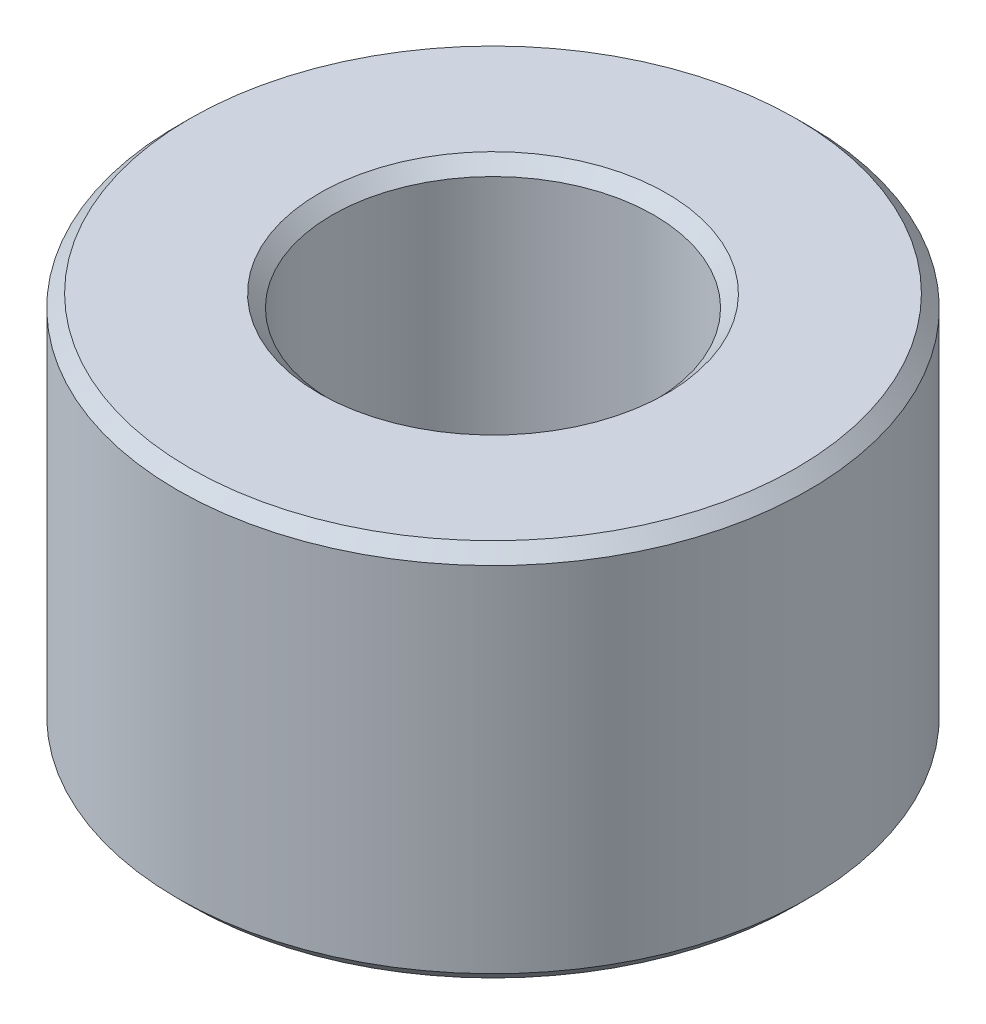
ISO-10303-21;
HEADER;
FILE_DESCRIPTION(('STEP AP214'),'2;1');
FILE_NAME('part.step','',(''),(''),'','','');
FILE_SCHEMA(('AUTOMOTIVE_DESIGN { 1 0 10303 214 1 1 1 1 }'));
ENDSEC;
DATA;
#1=APPLICATION_CONTEXT('core data for automotive mechanical design processes');
#2=APPLICATION_PROTOCOL_DEFINITION('international standard','automotive_design',2000,#1);
#3=PRODUCT_CONTEXT('',#1,'mechanical');
#4=PRODUCT('Part','Part','',(#3));
#5=PRODUCT_RELATED_PRODUCT_CATEGORY('part','',(#4));
#6=PRODUCT_DEFINITION_FORMATION('','',#4);
#7=PRODUCT_DEFINITION_CONTEXT('part definition',#1,'design');
#8=PRODUCT_DEFINITION('design','',#6,#7);
#9=PRODUCT_DEFINITION_SHAPE('','',#8);
#10=(LENGTH_UNIT() NAMED_UNIT(*) SI_UNIT(.MILLI.,.METRE.));
#11=(NAMED_UNIT(*) PLANE_ANGLE_UNIT() SI_UNIT($,.RADIAN.));
#12=(NAMED_UNIT(*) SI_UNIT($,.STERADIAN.) SOLID_ANGLE_UNIT());
#13=UNCERTAINTY_MEASURE_WITH_UNIT(LENGTH_MEASURE(1.E-05),#10,'distance_accuracy_value','');
#14=(GEOMETRIC_REPRESENTATION_CONTEXT(3) GLOBAL_UNCERTAINTY_ASSIGNED_CONTEXT((#13)) GLOBAL_UNIT_ASSIGNED_CONTEXT((#10,
#11,#12)) REPRESENTATION_CONTEXT('',''));
#15=CARTESIAN_POINT('',(0.,0.,0.));
#16=DIRECTION('',(0.,0.,1.));
#17=DIRECTION('',(1.,0.,0.));
#18=AXIS2_PLACEMENT_3D('',#15,#16,#17);
#19=CARTESIAN_POINT('',(0.,3.,-2.75));
#20=DIRECTION('',(0.,-1.,0.));
#21=DIRECTION('',(0.,0.,-1.));
#22=AXIS2_PLACEMENT_3D('',#19,#20,#21);
#23=PLANE('',#22);
#24=CARTESIAN_POINT('',(0.,3.,0.));
#25=DIRECTION('',(0.,1.,0.));
#26=DIRECTION('',(0.,0.,1.));
#27=AXIS2_PLACEMENT_3D('',#24,#25,#26);
#28=CIRCLE('',#27,2.75);
#29=CARTESIAN_POINT('',(0.,3.,2.75));
#30=VERTEX_POINT('',#29);
#31=EDGE_CURVE('E65',#30,#30,#28,.T.);
#32=ORIENTED_EDGE('',*,*,#31,.F.);
#33=EDGE_LOOP('',(#32));
#34=FACE_BOUND('',#33,.T.);
#35=CARTESIAN_POINT('',(0.,3.,0.));
#36=DIRECTION('',(0.,1.,0.));
#37=DIRECTION('',(0.,0.,1.));
#38=AXIS2_PLACEMENT_3D('',#35,#36,#37);
#39=CIRCLE('',#38,4.8);
#40=CARTESIAN_POINT('',(0.,3.,4.8));
#41=VERTEX_POINT('',#40);
#42=EDGE_CURVE('E10',#41,#41,#39,.T.);
#43=ORIENTED_EDGE('',*,*,#42,.T.);
#44=EDGE_LOOP('',(#43));
#45=FACE_BOUND('',#44,.T.);
#46=ADVANCED_FACE('F37',(#34,#45),#23,.F.);
#47=CARTESIAN_POINT('',(0.,2.8,0.));
#48=DIRECTION('',(0.,-1.,0.));
#49=DIRECTION('',(0.,0.,-1.));
#50=AXIS2_PLACEMENT_3D('',#47,#48,#49);
#51=CONICAL_SURFACE('',#50,5.,0.785398163397455);
#52=ORIENTED_EDGE('',*,*,#42,.F.);
#53=EDGE_LOOP('',(#52));
#54=FACE_BOUND('',#53,.T.);
#55=CARTESIAN_POINT('',(0.,2.8,0.));
#56=DIRECTION('',(0.,1.,0.));
#57=DIRECTION('',(0.,0.,1.));
#58=AXIS2_PLACEMENT_3D('',#55,#56,#57);
#59=CIRCLE('',#58,5.);
#60=CARTESIAN_POINT('',(0.,2.8,5.));
#61=VERTEX_POINT('',#60);
#62=EDGE_CURVE('E43',#61,#61,#59,.T.);
#63=ORIENTED_EDGE('',*,*,#62,.T.);
#64=EDGE_LOOP('',(#63));
#65=FACE_BOUND('',#64,.T.);
#66=ADVANCED_FACE('F72',(#54,#65),#51,.T.);
#67=CARTESIAN_POINT('',(0.,2.13387096774193,0.));
#68=DIRECTION('',(0.,1.,0.));
#69=DIRECTION('',(0.,0.,1.));
#70=AXIS2_PLACEMENT_3D('',#67,#68,#69);
#71=CYLINDRICAL_SURFACE('',#70,5.);
#72=ORIENTED_EDGE('',*,*,#62,.F.);
#73=EDGE_LOOP('',(#72));
#74=FACE_BOUND('',#73,.T.);
#75=CARTESIAN_POINT('',(0.,-2.8,0.));
#76=DIRECTION('',(0.,1.,0.));
#77=DIRECTION('',(0.,0.,1.));
#78=AXIS2_PLACEMENT_3D('',#75,#76,#77);
#79=CIRCLE('',#78,5.);
#80=CARTESIAN_POINT('',(0.,-2.8,5.));
#81=VERTEX_POINT('',#80);
#82=EDGE_CURVE('E47',#81,#81,#79,.T.);
#83=ORIENTED_EDGE('',*,*,#82,.T.);
#84=EDGE_LOOP('',(#83));
#85=FACE_BOUND('',#84,.T.);
#86=ADVANCED_FACE('F76',(#74,#85),#71,.T.);
#87=CARTESIAN_POINT('',(0.,-3.,0.));
#88=DIRECTION('',(0.,1.,0.));
#89=DIRECTION('',(0.,0.,1.));
#90=AXIS2_PLACEMENT_3D('',#87,#88,#89);
#91=CONICAL_SURFACE('',#90,4.8,0.785398163397446);
#92=ORIENTED_EDGE('',*,*,#82,.F.);
#93=EDGE_LOOP('',(#92));
#94=FACE_BOUND('',#93,.T.);
#95=CARTESIAN_POINT('',(0.,-3.,0.));
#96=DIRECTION('',(0.,1.,0.));
#97=DIRECTION('',(0.,0.,1.));
#98=AXIS2_PLACEMENT_3D('',#95,#96,#97);
#99=CIRCLE('',#98,4.8);
#100=CARTESIAN_POINT('',(0.,-3.,4.8));
#101=VERTEX_POINT('',#100);
#102=EDGE_CURVE('E51',#101,#101,#99,.T.);
#103=ORIENTED_EDGE('',*,*,#102,.T.);
#104=EDGE_LOOP('',(#103));
#105=FACE_BOUND('',#104,.T.);
#106=ADVANCED_FACE('F81',(#94,#105),#91,.T.);
#107=CARTESIAN_POINT('',(0.,-3.,-2.75));
#108=DIRECTION('',(0.,1.,0.));
#109=DIRECTION('',(0.,0.,1.));
#110=AXIS2_PLACEMENT_3D('',#107,#108,#109);
#111=PLANE('',#110);
#112=ORIENTED_EDGE('',*,*,#102,.F.);
#113=EDGE_LOOP('',(#112));
#114=FACE_BOUND('',#113,.T.);
#115=CARTESIAN_POINT('',(0.,-3.,0.));
#116=DIRECTION('',(0.,1.,0.));
#117=DIRECTION('',(0.,0.,1.));
#118=AXIS2_PLACEMENT_3D('',#115,#116,#117);
#119=CIRCLE('',#118,2.75);
#120=CARTESIAN_POINT('',(0.,-3.,2.75));
#121=VERTEX_POINT('',#120);
#122=EDGE_CURVE('E56',#121,#121,#119,.T.);
#123=ORIENTED_EDGE('',*,*,#122,.T.);
#124=EDGE_LOOP('',(#123));
#125=FACE_BOUND('',#124,.T.);
#126=ADVANCED_FACE('F87',(#114,#125),#111,.F.);
#127=CARTESIAN_POINT('',(0.,-2.8,0.));
#128=DIRECTION('',(0.,-1.,0.));
#129=DIRECTION('',(0.,0.,-1.));
#130=AXIS2_PLACEMENT_3D('',#127,#128,#129);
#131=CONICAL_SURFACE('',#130,2.55,0.785398163397448);
#132=ORIENTED_EDGE('',*,*,#122,.F.);
#133=EDGE_LOOP('',(#132));
#134=FACE_BOUND('',#133,.T.);
#135=CARTESIAN_POINT('',(0.,-2.8,0.));
#136=DIRECTION('',(0.,1.,0.));
#137=DIRECTION('',(0.,0.,1.));
#138=AXIS2_PLACEMENT_3D('',#135,#136,#137);
#139=CIRCLE('',#138,2.55);
#140=CARTESIAN_POINT('',(0.,-2.8,2.55));
#141=VERTEX_POINT('',#140);
#142=EDGE_CURVE('E59',#141,#141,#139,.T.);
#143=ORIENTED_EDGE('',*,*,#142,.T.);
#144=EDGE_LOOP('',(#143));
#145=FACE_BOUND('',#144,.T.);
#146=ADVANCED_FACE('F91',(#134,#145),#131,.F.);
#147=CARTESIAN_POINT('',(0.,2.13387096774193,0.));
#148=DIRECTION('',(0.,1.,0.));
#149=DIRECTION('',(0.,0.,1.));
#150=AXIS2_PLACEMENT_3D('',#147,#148,#149);
#151=CYLINDRICAL_SURFACE('',#150,2.55);
#152=ORIENTED_EDGE('',*,*,#142,.F.);
#153=EDGE_LOOP('',(#152));
#154=FACE_BOUND('',#153,.T.);
#155=CARTESIAN_POINT('',(0.,2.8,0.));
#156=DIRECTION('',(0.,1.,0.));
#157=DIRECTION('',(0.,0.,1.));
#158=AXIS2_PLACEMENT_3D('',#155,#156,#157);
#159=CIRCLE('',#158,2.55);
#160=CARTESIAN_POINT('',(0.,2.8,2.55));
#161=VERTEX_POINT('',#160);
#162=EDGE_CURVE('E62',#161,#161,#159,.T.);
#163=ORIENTED_EDGE('',*,*,#162,.T.);
#164=EDGE_LOOP('',(#163));
#165=FACE_BOUND('',#164,.T.);
#166=ADVANCED_FACE('F95',(#154,#165),#151,.F.);
#167=CARTESIAN_POINT('',(0.,3.,0.));
#168=DIRECTION('',(0.,1.,0.));
#169=DIRECTION('',(0.,0.,1.));
#170=AXIS2_PLACEMENT_3D('',#167,#168,#169);
#171=CONICAL_SURFACE('',#170,2.75,0.785398163397447);
#172=ORIENTED_EDGE('',*,*,#162,.F.);
#173=EDGE_LOOP('',(#172));
#174=FACE_BOUND('',#173,.T.);
#175=ORIENTED_EDGE('',*,*,#31,.T.);
#176=EDGE_LOOP('',(#175));
#177=FACE_BOUND('',#176,.T.);
#178=ADVANCED_FACE('F69',(#174,#177),#171,.F.);
#179=CLOSED_SHELL('',(#46,#66,#86,#106,#126,#146,#166,#178));
#180=MANIFOLD_SOLID_BREP('B2',#179);
#181=ADVANCED_BREP_SHAPE_REPRESENTATION('',(#18,#180),#14);
#182=SHAPE_DEFINITION_REPRESENTATION(#9,#181);
ENDSEC;
END-ISO-10303-21;
